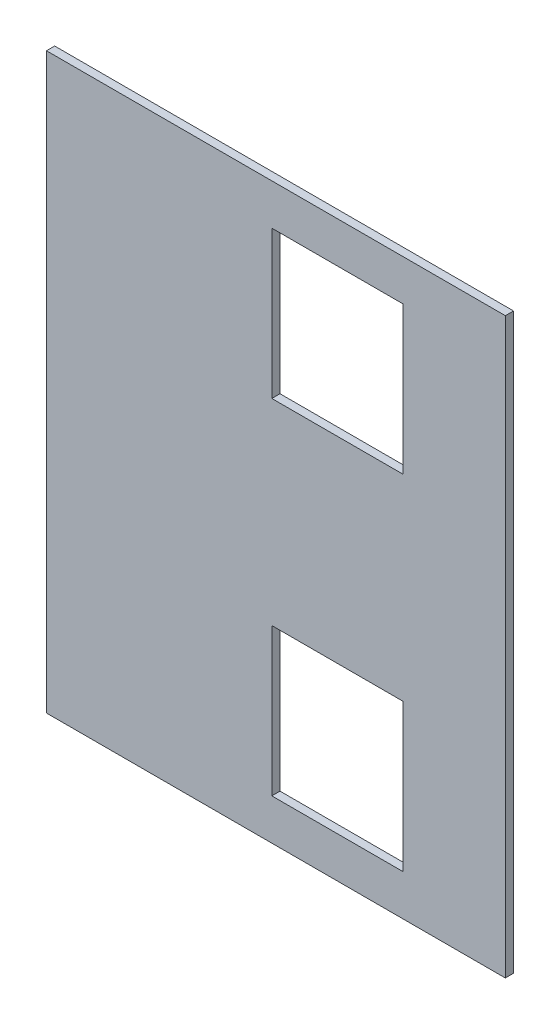
ISO-10303-21;
HEADER;
FILE_DESCRIPTION(('STEP AP214'),'2;1');
FILE_NAME('part.step','',(''),(''),'','','');
FILE_SCHEMA(('AUTOMOTIVE_DESIGN { 1 0 10303 214 1 1 1 1 }'));
ENDSEC;
DATA;
#1=APPLICATION_CONTEXT('core data for automotive mechanical design processes');
#2=APPLICATION_PROTOCOL_DEFINITION('international standard','automotive_design',2000,#1);
#3=PRODUCT_CONTEXT('',#1,'mechanical');
#4=PRODUCT('Part','Part','',(#3));
#5=PRODUCT_RELATED_PRODUCT_CATEGORY('part','',(#4));
#6=PRODUCT_DEFINITION_FORMATION('','',#4);
#7=PRODUCT_DEFINITION_CONTEXT('part definition',#1,'design');
#8=PRODUCT_DEFINITION('design','',#6,#7);
#9=PRODUCT_DEFINITION_SHAPE('','',#8);
#10=(LENGTH_UNIT() NAMED_UNIT(*) SI_UNIT(.MILLI.,.METRE.));
#11=(NAMED_UNIT(*) PLANE_ANGLE_UNIT() SI_UNIT($,.RADIAN.));
#12=(NAMED_UNIT(*) SI_UNIT($,.STERADIAN.) SOLID_ANGLE_UNIT());
#13=UNCERTAINTY_MEASURE_WITH_UNIT(LENGTH_MEASURE(1.E-05),#10,'distance_accuracy_value','');
#14=(GEOMETRIC_REPRESENTATION_CONTEXT(3) GLOBAL_UNCERTAINTY_ASSIGNED_CONTEXT((#13)) GLOBAL_UNIT_ASSIGNED_CONTEXT((#10,
#11,#12)) REPRESENTATION_CONTEXT('',''));
#15=CARTESIAN_POINT('',(0.,0.,0.));
#16=DIRECTION('',(0.,0.,1.));
#17=DIRECTION('',(1.,0.,0.));
#18=AXIS2_PLACEMENT_3D('',#15,#16,#17);
#19=CARTESIAN_POINT('',(0.,0.,10.));
#20=DIRECTION('',(1.,0.,0.));
#21=DIRECTION('',(0.,0.,-1.));
#22=AXIS2_PLACEMENT_3D('',#19,#20,#21);
#23=PLANE('',#22);
#24=DIRECTION('',(0.,-1.,0.));
#25=VECTOR('',#24,1.);
#26=CARTESIAN_POINT('',(0.,0.,0.));
#27=LINE('',#26,#25);
#28=CARTESIAN_POINT('',(0.,0.,0.));
#29=VERTEX_POINT('',#28);
#30=CARTESIAN_POINT('',(0.,-700.,0.));
#31=VERTEX_POINT('',#30);
#32=EDGE_CURVE('E162',#29,#31,#27,.T.);
#33=ORIENTED_EDGE('',*,*,#32,.T.);
#34=DIRECTION('',(0.,0.,-1.));
#35=VECTOR('',#34,1.);
#36=CARTESIAN_POINT('',(0.,-700.,10.));
#37=LINE('',#36,#35);
#38=CARTESIAN_POINT('',(0.,-700.,10.));
#39=VERTEX_POINT('',#38);
#40=EDGE_CURVE('E11',#39,#31,#37,.T.);
#41=ORIENTED_EDGE('',*,*,#40,.F.);
#42=DIRECTION('',(0.,-1.,0.));
#43=VECTOR('',#42,1.);
#44=CARTESIAN_POINT('',(0.,0.,10.));
#45=LINE('',#44,#43);
#46=CARTESIAN_POINT('',(0.,0.,10.));
#47=VERTEX_POINT('',#46);
#48=EDGE_CURVE('E197',#47,#39,#45,.T.);
#49=ORIENTED_EDGE('',*,*,#48,.F.);
#50=DIRECTION('',(0.,0.,-1.));
#51=VECTOR('',#50,1.);
#52=CARTESIAN_POINT('',(0.,0.,10.));
#53=LINE('',#52,#51);
#54=EDGE_CURVE('E210',#47,#29,#53,.T.);
#55=ORIENTED_EDGE('',*,*,#54,.T.);
#56=EDGE_LOOP('',(#33,#41,#49,#55));
#57=FACE_BOUND('',#56,.T.);
#58=ADVANCED_FACE('F39',(#57),#23,.F.);
#59=CARTESIAN_POINT('',(0.,-700.,10.));
#60=DIRECTION('',(0.,1.,0.));
#61=DIRECTION('',(0.,0.,1.));
#62=AXIS2_PLACEMENT_3D('',#59,#60,#61);
#63=PLANE('',#62);
#64=DIRECTION('',(1.,0.,0.));
#65=VECTOR('',#64,1.);
#66=CARTESIAN_POINT('',(0.,-700.,0.));
#67=LINE('',#66,#65);
#68=CARTESIAN_POINT('',(560.,-700.,0.));
#69=VERTEX_POINT('',#68);
#70=EDGE_CURVE('E209',#31,#69,#67,.T.);
#71=ORIENTED_EDGE('',*,*,#70,.T.);
#72=DIRECTION('',(0.,0.,-1.));
#73=VECTOR('',#72,1.);
#74=CARTESIAN_POINT('',(560.,-700.,10.));
#75=LINE('',#74,#73);
#76=CARTESIAN_POINT('',(560.,-700.,10.));
#77=VERTEX_POINT('',#76);
#78=EDGE_CURVE('E46',#77,#69,#75,.T.);
#79=ORIENTED_EDGE('',*,*,#78,.F.);
#80=DIRECTION('',(1.,0.,0.));
#81=VECTOR('',#80,1.);
#82=CARTESIAN_POINT('',(0.,-700.,10.));
#83=LINE('',#82,#81);
#84=EDGE_CURVE('E199',#39,#77,#83,.T.);
#85=ORIENTED_EDGE('',*,*,#84,.F.);
#86=ORIENTED_EDGE('',*,*,#40,.T.);
#87=EDGE_LOOP('',(#71,#79,#85,#86));
#88=FACE_BOUND('',#87,.T.);
#89=ADVANCED_FACE('F239',(#88),#63,.F.);
#90=CARTESIAN_POINT('',(560.,0.,10.));
#91=DIRECTION('',(-1.,0.,0.));
#92=DIRECTION('',(0.,0.,1.));
#93=AXIS2_PLACEMENT_3D('',#90,#91,#92);
#94=PLANE('',#93);
#95=DIRECTION('',(0.,1.,0.));
#96=VECTOR('',#95,1.);
#97=CARTESIAN_POINT('',(560.,0.,0.));
#98=LINE('',#97,#96);
#99=CARTESIAN_POINT('',(560.,0.,0.));
#100=VERTEX_POINT('',#99);
#101=EDGE_CURVE('E215',#69,#100,#98,.T.);
#102=ORIENTED_EDGE('',*,*,#101,.T.);
#103=DIRECTION('',(0.,0.,-1.));
#104=VECTOR('',#103,1.);
#105=CARTESIAN_POINT('',(560.,0.,10.));
#106=LINE('',#105,#104);
#107=CARTESIAN_POINT('',(560.,0.,10.));
#108=VERTEX_POINT('',#107);
#109=EDGE_CURVE('E220',#108,#100,#106,.T.);
#110=ORIENTED_EDGE('',*,*,#109,.F.);
#111=DIRECTION('',(0.,1.,0.));
#112=VECTOR('',#111,1.);
#113=CARTESIAN_POINT('',(560.,0.,10.));
#114=LINE('',#113,#112);
#115=EDGE_CURVE('E201',#77,#108,#114,.T.);
#116=ORIENTED_EDGE('',*,*,#115,.F.);
#117=ORIENTED_EDGE('',*,*,#78,.T.);
#118=EDGE_LOOP('',(#102,#110,#116,#117));
#119=FACE_BOUND('',#118,.T.);
#120=ADVANCED_FACE('F221',(#119),#94,.F.);
#121=CARTESIAN_POINT('',(0.,0.,10.));
#122=DIRECTION('',(0.,-1.,0.));
#123=DIRECTION('',(0.,0.,-1.));
#124=AXIS2_PLACEMENT_3D('',#121,#122,#123);
#125=PLANE('',#124);
#126=DIRECTION('',(-1.,0.,0.));
#127=VECTOR('',#126,1.);
#128=CARTESIAN_POINT('',(0.,0.,0.));
#129=LINE('',#128,#127);
#130=EDGE_CURVE('E203',#100,#29,#129,.T.);
#131=ORIENTED_EDGE('',*,*,#130,.T.);
#132=ORIENTED_EDGE('',*,*,#54,.F.);
#133=DIRECTION('',(-1.,0.,0.));
#134=VECTOR('',#133,1.);
#135=CARTESIAN_POINT('',(0.,0.,10.));
#136=LINE('',#135,#134);
#137=EDGE_CURVE('E202',#108,#47,#136,.T.);
#138=ORIENTED_EDGE('',*,*,#137,.F.);
#139=ORIENTED_EDGE('',*,*,#109,.T.);
#140=EDGE_LOOP('',(#131,#132,#138,#139));
#141=FACE_BOUND('',#140,.T.);
#142=ADVANCED_FACE('F235',(#141),#125,.F.);
#143=CARTESIAN_POINT('',(0.,0.,10.));
#144=DIRECTION('',(0.,0.,1.));
#145=DIRECTION('',(1.,0.,0.));
#146=AXIS2_PLACEMENT_3D('',#143,#144,#145);
#147=PLANE('',#146);
#148=DIRECTION('',(0.,-1.,0.));
#149=VECTOR('',#148,1.);
#150=CARTESIAN_POINT('',(275.,-50.,10.));
#151=LINE('',#150,#149);
#152=CARTESIAN_POINT('',(275.,-50.,10.));
#153=VERTEX_POINT('',#152);
#154=CARTESIAN_POINT('',(275.,-230.,10.));
#155=VERTEX_POINT('',#154);
#156=EDGE_CURVE('E52',#153,#155,#151,.T.);
#157=ORIENTED_EDGE('',*,*,#156,.F.);
#158=DIRECTION('',(-1.,0.,0.));
#159=VECTOR('',#158,1.);
#160=CARTESIAN_POINT('',(275.,-50.,10.));
#161=LINE('',#160,#159);
#162=CARTESIAN_POINT('',(435.,-50.,10.));
#163=VERTEX_POINT('',#162);
#164=EDGE_CURVE('E146',#163,#153,#161,.T.);
#165=ORIENTED_EDGE('',*,*,#164,.F.);
#166=DIRECTION('',(0.,1.,0.));
#167=VECTOR('',#166,1.);
#168=CARTESIAN_POINT('',(435.,-50.,10.));
#169=LINE('',#168,#167);
#170=CARTESIAN_POINT('',(435.,-230.,10.));
#171=VERTEX_POINT('',#170);
#172=EDGE_CURVE('E151',#171,#163,#169,.T.);
#173=ORIENTED_EDGE('',*,*,#172,.F.);
#174=DIRECTION('',(1.,0.,0.));
#175=VECTOR('',#174,1.);
#176=CARTESIAN_POINT('',(275.,-230.,10.));
#177=LINE('',#176,#175);
#178=EDGE_CURVE('E160',#155,#171,#177,.T.);
#179=ORIENTED_EDGE('',*,*,#178,.F.);
#180=EDGE_LOOP('',(#157,#165,#173,#179));
#181=FACE_BOUND('',#180,.T.);
#182=DIRECTION('',(1.,0.,0.));
#183=VECTOR('',#182,1.);
#184=CARTESIAN_POINT('',(275.,-650.,10.));
#185=LINE('',#184,#183);
#186=CARTESIAN_POINT('',(275.,-650.,10.));
#187=VERTEX_POINT('',#186);
#188=CARTESIAN_POINT('',(435.,-650.,10.));
#189=VERTEX_POINT('',#188);
#190=EDGE_CURVE('E63',#187,#189,#185,.T.);
#191=ORIENTED_EDGE('',*,*,#190,.F.);
#192=DIRECTION('',(0.,-1.,0.));
#193=VECTOR('',#192,1.);
#194=CARTESIAN_POINT('',(275.,-650.,10.));
#195=LINE('',#194,#193);
#196=CARTESIAN_POINT('',(275.,-470.,10.));
#197=VERTEX_POINT('',#196);
#198=EDGE_CURVE('E176',#197,#187,#195,.T.);
#199=ORIENTED_EDGE('',*,*,#198,.F.);
#200=DIRECTION('',(-1.,0.,0.));
#201=VECTOR('',#200,1.);
#202=CARTESIAN_POINT('',(275.,-470.,10.));
#203=LINE('',#202,#201);
#204=CARTESIAN_POINT('',(435.,-470.,10.));
#205=VERTEX_POINT('',#204);
#206=EDGE_CURVE('E178',#205,#197,#203,.T.);
#207=ORIENTED_EDGE('',*,*,#206,.F.);
#208=DIRECTION('',(0.,1.,0.));
#209=VECTOR('',#208,1.);
#210=CARTESIAN_POINT('',(435.,-650.,10.));
#211=LINE('',#210,#209);
#212=EDGE_CURVE('E181',#189,#205,#211,.T.);
#213=ORIENTED_EDGE('',*,*,#212,.F.);
#214=EDGE_LOOP('',(#191,#199,#207,#213));
#215=FACE_BOUND('',#214,.T.);
#216=ORIENTED_EDGE('',*,*,#48,.T.);
#217=ORIENTED_EDGE('',*,*,#84,.T.);
#218=ORIENTED_EDGE('',*,*,#115,.T.);
#219=ORIENTED_EDGE('',*,*,#137,.T.);
#220=EDGE_LOOP('',(#216,#217,#218,#219));
#221=FACE_BOUND('',#220,.T.);
#222=ADVANCED_FACE('F236',(#181,#215,#221),#147,.T.);
#223=CARTESIAN_POINT('',(0.,0.,0.));
#224=DIRECTION('',(0.,0.,1.));
#225=DIRECTION('',(1.,0.,0.));
#226=AXIS2_PLACEMENT_3D('',#223,#224,#225);
#227=PLANE('',#226);
#228=DIRECTION('',(-1.,0.,0.));
#229=VECTOR('',#228,1.);
#230=CARTESIAN_POINT('',(275.,-50.,0.));
#231=LINE('',#230,#229);
#232=CARTESIAN_POINT('',(435.,-50.,0.));
#233=VERTEX_POINT('',#232);
#234=CARTESIAN_POINT('',(275.,-50.,0.));
#235=VERTEX_POINT('',#234);
#236=EDGE_CURVE('E131',#233,#235,#231,.T.);
#237=ORIENTED_EDGE('',*,*,#236,.T.);
#238=DIRECTION('',(0.,-1.,0.));
#239=VECTOR('',#238,1.);
#240=CARTESIAN_POINT('',(275.,-50.,0.));
#241=LINE('',#240,#239);
#242=CARTESIAN_POINT('',(275.,-230.,0.));
#243=VERTEX_POINT('',#242);
#244=EDGE_CURVE('E129',#235,#243,#241,.T.);
#245=ORIENTED_EDGE('',*,*,#244,.T.);
#246=DIRECTION('',(1.,0.,0.));
#247=VECTOR('',#246,1.);
#248=CARTESIAN_POINT('',(275.,-230.,0.));
#249=LINE('',#248,#247);
#250=CARTESIAN_POINT('',(435.,-230.,0.));
#251=VERTEX_POINT('',#250);
#252=EDGE_CURVE('E138',#243,#251,#249,.T.);
#253=ORIENTED_EDGE('',*,*,#252,.T.);
#254=DIRECTION('',(0.,1.,0.));
#255=VECTOR('',#254,1.);
#256=CARTESIAN_POINT('',(435.,-50.,0.));
#257=LINE('',#256,#255);
#258=EDGE_CURVE('E141',#251,#233,#257,.T.);
#259=ORIENTED_EDGE('',*,*,#258,.T.);
#260=EDGE_LOOP('',(#237,#245,#253,#259));
#261=FACE_BOUND('',#260,.T.);
#262=DIRECTION('',(0.,-1.,0.));
#263=VECTOR('',#262,1.);
#264=CARTESIAN_POINT('',(275.,-650.,0.));
#265=LINE('',#264,#263);
#266=CARTESIAN_POINT('',(275.,-470.,0.));
#267=VERTEX_POINT('',#266);
#268=CARTESIAN_POINT('',(275.,-650.,0.));
#269=VERTEX_POINT('',#268);
#270=EDGE_CURVE('E166',#267,#269,#265,.T.);
#271=ORIENTED_EDGE('',*,*,#270,.T.);
#272=DIRECTION('',(1.,0.,0.));
#273=VECTOR('',#272,1.);
#274=CARTESIAN_POINT('',(275.,-650.,0.));
#275=LINE('',#274,#273);
#276=CARTESIAN_POINT('',(435.,-650.,0.));
#277=VERTEX_POINT('',#276);
#278=EDGE_CURVE('E179',#269,#277,#275,.T.);
#279=ORIENTED_EDGE('',*,*,#278,.T.);
#280=DIRECTION('',(0.,1.,0.));
#281=VECTOR('',#280,1.);
#282=CARTESIAN_POINT('',(435.,-650.,0.));
#283=LINE('',#282,#281);
#284=CARTESIAN_POINT('',(435.,-470.,0.));
#285=VERTEX_POINT('',#284);
#286=EDGE_CURVE('E195',#277,#285,#283,.T.);
#287=ORIENTED_EDGE('',*,*,#286,.T.);
#288=DIRECTION('',(-1.,0.,0.));
#289=VECTOR('',#288,1.);
#290=CARTESIAN_POINT('',(275.,-470.,0.));
#291=LINE('',#290,#289);
#292=EDGE_CURVE('E190',#285,#267,#291,.T.);
#293=ORIENTED_EDGE('',*,*,#292,.T.);
#294=EDGE_LOOP('',(#271,#279,#287,#293));
#295=FACE_BOUND('',#294,.T.);
#296=ORIENTED_EDGE('',*,*,#32,.F.);
#297=ORIENTED_EDGE('',*,*,#130,.F.);
#298=ORIENTED_EDGE('',*,*,#101,.F.);
#299=ORIENTED_EDGE('',*,*,#70,.F.);
#300=EDGE_LOOP('',(#296,#297,#298,#299));
#301=FACE_BOUND('',#300,.T.);
#302=ADVANCED_FACE('F144',(#261,#295,#301),#227,.F.);
#303=CARTESIAN_POINT('',(275.,-650.,0.));
#304=DIRECTION('',(0.,-1.,0.));
#305=DIRECTION('',(0.,0.,-1.));
#306=AXIS2_PLACEMENT_3D('',#303,#304,#305);
#307=PLANE('',#306);
#308=ORIENTED_EDGE('',*,*,#190,.T.);
#309=DIRECTION('',(0.,0.,1.));
#310=VECTOR('',#309,1.);
#311=CARTESIAN_POINT('',(435.,-650.,0.));
#312=LINE('',#311,#310);
#313=EDGE_CURVE('E170',#277,#189,#312,.T.);
#314=ORIENTED_EDGE('',*,*,#313,.F.);
#315=ORIENTED_EDGE('',*,*,#278,.F.);
#316=DIRECTION('',(0.,0.,1.));
#317=VECTOR('',#316,1.);
#318=CARTESIAN_POINT('',(275.,-650.,0.));
#319=LINE('',#318,#317);
#320=EDGE_CURVE('E175',#269,#187,#319,.T.);
#321=ORIENTED_EDGE('',*,*,#320,.T.);
#322=EDGE_LOOP('',(#308,#314,#315,#321));
#323=FACE_BOUND('',#322,.T.);
#324=ADVANCED_FACE('F253',(#323),#307,.F.);
#325=CARTESIAN_POINT('',(275.,-650.,0.));
#326=DIRECTION('',(-1.,0.,0.));
#327=DIRECTION('',(0.,-1.,0.));
#328=AXIS2_PLACEMENT_3D('',#325,#326,#327);
#329=PLANE('',#328);
#330=ORIENTED_EDGE('',*,*,#198,.T.);
#331=ORIENTED_EDGE('',*,*,#320,.F.);
#332=ORIENTED_EDGE('',*,*,#270,.F.);
#333=DIRECTION('',(0.,0.,1.));
#334=VECTOR('',#333,1.);
#335=CARTESIAN_POINT('',(275.,-470.,0.));
#336=LINE('',#335,#334);
#337=EDGE_CURVE('E174',#267,#197,#336,.T.);
#338=ORIENTED_EDGE('',*,*,#337,.T.);
#339=EDGE_LOOP('',(#330,#331,#332,#338));
#340=FACE_BOUND('',#339,.T.);
#341=ADVANCED_FACE('F254',(#340),#329,.F.);
#342=CARTESIAN_POINT('',(275.,-470.,0.));
#343=DIRECTION('',(0.,1.,0.));
#344=DIRECTION('',(0.,0.,1.));
#345=AXIS2_PLACEMENT_3D('',#342,#343,#344);
#346=PLANE('',#345);
#347=ORIENTED_EDGE('',*,*,#206,.T.);
#348=ORIENTED_EDGE('',*,*,#337,.F.);
#349=ORIENTED_EDGE('',*,*,#292,.F.);
#350=DIRECTION('',(0.,0.,1.));
#351=VECTOR('',#350,1.);
#352=CARTESIAN_POINT('',(435.,-470.,0.));
#353=LINE('',#352,#351);
#354=EDGE_CURVE('E168',#285,#205,#353,.T.);
#355=ORIENTED_EDGE('',*,*,#354,.T.);
#356=EDGE_LOOP('',(#347,#348,#349,#355));
#357=FACE_BOUND('',#356,.T.);
#358=ADVANCED_FACE('F256',(#357),#346,.F.);
#359=CARTESIAN_POINT('',(435.,-650.,0.));
#360=DIRECTION('',(1.,0.,0.));
#361=DIRECTION('',(0.,0.,-1.));
#362=AXIS2_PLACEMENT_3D('',#359,#360,#361);
#363=PLANE('',#362);
#364=ORIENTED_EDGE('',*,*,#212,.T.);
#365=ORIENTED_EDGE('',*,*,#354,.F.);
#366=ORIENTED_EDGE('',*,*,#286,.F.);
#367=ORIENTED_EDGE('',*,*,#313,.T.);
#368=EDGE_LOOP('',(#364,#365,#366,#367));
#369=FACE_BOUND('',#368,.T.);
#370=ADVANCED_FACE('F265',(#369),#363,.F.);
#371=CARTESIAN_POINT('',(275.,-50.,0.));
#372=DIRECTION('',(-1.,0.,0.));
#373=DIRECTION('',(0.,-1.,0.));
#374=AXIS2_PLACEMENT_3D('',#371,#372,#373);
#375=PLANE('',#374);
#376=ORIENTED_EDGE('',*,*,#156,.T.);
#377=DIRECTION('',(0.,0.,1.));
#378=VECTOR('',#377,1.);
#379=CARTESIAN_POINT('',(275.,-230.,0.));
#380=LINE('',#379,#378);
#381=EDGE_CURVE('E124',#243,#155,#380,.T.);
#382=ORIENTED_EDGE('',*,*,#381,.F.);
#383=ORIENTED_EDGE('',*,*,#244,.F.);
#384=DIRECTION('',(0.,0.,1.));
#385=VECTOR('',#384,1.);
#386=CARTESIAN_POINT('',(275.,-50.,0.));
#387=LINE('',#386,#385);
#388=EDGE_CURVE('E161',#235,#153,#387,.T.);
#389=ORIENTED_EDGE('',*,*,#388,.T.);
#390=EDGE_LOOP('',(#376,#382,#383,#389));
#391=FACE_BOUND('',#390,.T.);
#392=ADVANCED_FACE('F130',(#391),#375,.F.);
#393=CARTESIAN_POINT('',(275.,-50.,0.));
#394=DIRECTION('',(0.,1.,0.));
#395=DIRECTION('',(0.,0.,1.));
#396=AXIS2_PLACEMENT_3D('',#393,#394,#395);
#397=PLANE('',#396);
#398=ORIENTED_EDGE('',*,*,#164,.T.);
#399=ORIENTED_EDGE('',*,*,#388,.F.);
#400=ORIENTED_EDGE('',*,*,#236,.F.);
#401=DIRECTION('',(0.,0.,1.));
#402=VECTOR('',#401,1.);
#403=CARTESIAN_POINT('',(435.,-50.,0.));
#404=LINE('',#403,#402);
#405=EDGE_CURVE('E163',#233,#163,#404,.T.);
#406=ORIENTED_EDGE('',*,*,#405,.T.);
#407=EDGE_LOOP('',(#398,#399,#400,#406));
#408=FACE_BOUND('',#407,.T.);
#409=ADVANCED_FACE('F271',(#408),#397,.F.);
#410=CARTESIAN_POINT('',(435.,-50.,0.));
#411=DIRECTION('',(1.,0.,0.));
#412=DIRECTION('',(0.,0.,-1.));
#413=AXIS2_PLACEMENT_3D('',#410,#411,#412);
#414=PLANE('',#413);
#415=ORIENTED_EDGE('',*,*,#172,.T.);
#416=ORIENTED_EDGE('',*,*,#405,.F.);
#417=ORIENTED_EDGE('',*,*,#258,.F.);
#418=DIRECTION('',(0.,0.,1.));
#419=VECTOR('',#418,1.);
#420=CARTESIAN_POINT('',(435.,-230.,0.));
#421=LINE('',#420,#419);
#422=EDGE_CURVE('E135',#251,#171,#421,.T.);
#423=ORIENTED_EDGE('',*,*,#422,.T.);
#424=EDGE_LOOP('',(#415,#416,#417,#423));
#425=FACE_BOUND('',#424,.T.);
#426=ADVANCED_FACE('F273',(#425),#414,.F.);
#427=CARTESIAN_POINT('',(275.,-230.,0.));
#428=DIRECTION('',(0.,-1.,0.));
#429=DIRECTION('',(0.,0.,-1.));
#430=AXIS2_PLACEMENT_3D('',#427,#428,#429);
#431=PLANE('',#430);
#432=ORIENTED_EDGE('',*,*,#178,.T.);
#433=ORIENTED_EDGE('',*,*,#422,.F.);
#434=ORIENTED_EDGE('',*,*,#252,.F.);
#435=ORIENTED_EDGE('',*,*,#381,.T.);
#436=EDGE_LOOP('',(#432,#433,#434,#435));
#437=FACE_BOUND('',#436,.T.);
#438=ADVANCED_FACE('F139',(#437),#431,.F.);
#439=CLOSED_SHELL('',(#58,#89,#120,#142,#222,#302,#324,#341,#358,#370,#392,#409,#426,#438));
#440=MANIFOLD_SOLID_BREP('B2',#439);
#441=ADVANCED_BREP_SHAPE_REPRESENTATION('',(#18,#440),#14);
#442=SHAPE_DEFINITION_REPRESENTATION(#9,#441);
ENDSEC;
END-ISO-10303-21;
